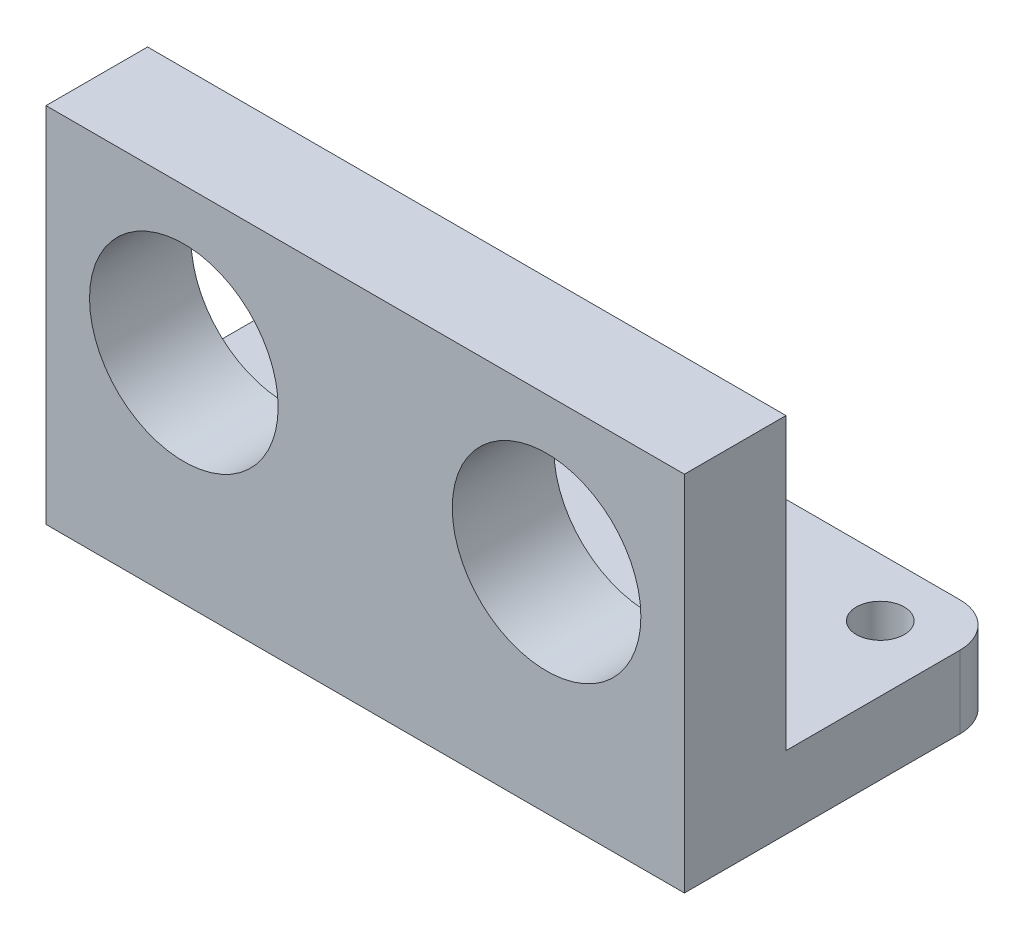
ISO-10303-21;
HEADER;
FILE_DESCRIPTION(('STEP AP214'),'2;1');
FILE_NAME('part.step','',(''),(''),'','','');
FILE_SCHEMA(('AUTOMOTIVE_DESIGN { 1 0 10303 214 1 1 1 1 }'));
ENDSEC;
DATA;
#1=APPLICATION_CONTEXT('core data for automotive mechanical design processes');
#2=APPLICATION_PROTOCOL_DEFINITION('international standard','automotive_design',2000,#1);
#3=PRODUCT_CONTEXT('',#1,'mechanical');
#4=PRODUCT('Part','Part','',(#3));
#5=PRODUCT_RELATED_PRODUCT_CATEGORY('part','',(#4));
#6=PRODUCT_DEFINITION_FORMATION('','',#4);
#7=PRODUCT_DEFINITION_CONTEXT('part definition',#1,'design');
#8=PRODUCT_DEFINITION('design','',#6,#7);
#9=PRODUCT_DEFINITION_SHAPE('','',#8);
#10=(LENGTH_UNIT() NAMED_UNIT(*) SI_UNIT(.MILLI.,.METRE.));
#11=(NAMED_UNIT(*) PLANE_ANGLE_UNIT() SI_UNIT($,.RADIAN.));
#12=(NAMED_UNIT(*) SI_UNIT($,.STERADIAN.) SOLID_ANGLE_UNIT());
#13=UNCERTAINTY_MEASURE_WITH_UNIT(LENGTH_MEASURE(1.E-05),#10,'distance_accuracy_value','');
#14=(GEOMETRIC_REPRESENTATION_CONTEXT(3) GLOBAL_UNCERTAINTY_ASSIGNED_CONTEXT((#13)) GLOBAL_UNIT_ASSIGNED_CONTEXT((#10,
#11,#12)) REPRESENTATION_CONTEXT('',''));
#15=CARTESIAN_POINT('',(0.,0.,0.));
#16=DIRECTION('',(0.,0.,1.));
#17=DIRECTION('',(1.,0.,0.));
#18=AXIS2_PLACEMENT_3D('',#15,#16,#17);
#19=CARTESIAN_POINT('',(0.,0.,7.));
#20=DIRECTION('',(0.,0.,1.));
#21=DIRECTION('',(1.,0.,0.));
#22=AXIS2_PLACEMENT_3D('',#19,#20,#21);
#23=PLANE('',#22);
#24=CARTESIAN_POINT('',(-12.5,0.,7.));
#25=DIRECTION('',(0.,0.,1.));
#26=DIRECTION('',(1.,0.,0.));
#27=AXIS2_PLACEMENT_3D('',#24,#25,#26);
#28=CIRCLE('',#27,6.5);
#29=CARTESIAN_POINT('',(-6.,0.,7.));
#30=VERTEX_POINT('',#29);
#31=EDGE_CURVE('E119',#30,#30,#28,.T.);
#32=ORIENTED_EDGE('',*,*,#31,.F.);
#33=EDGE_LOOP('',(#32));
#34=FACE_BOUND('',#33,.T.);
#35=DIRECTION('',(0.,-1.,0.));
#36=VECTOR('',#35,1.);
#37=CARTESIAN_POINT('',(-22.,-10.,7.));
#38=LINE('',#37,#36);
#39=CARTESIAN_POINT('',(-22.,10.,7.));
#40=VERTEX_POINT('',#39);
#41=CARTESIAN_POINT('',(-22.,-15.,7.));
#42=VERTEX_POINT('',#41);
#43=EDGE_CURVE('E131',#40,#42,#38,.T.);
#44=ORIENTED_EDGE('',*,*,#43,.T.);
#45=DIRECTION('',(1.,0.,0.));
#46=VECTOR('',#45,1.);
#47=CARTESIAN_POINT('',(-22.,-15.,7.));
#48=LINE('',#47,#46);
#49=CARTESIAN_POINT('',(22.,-15.,7.));
#50=VERTEX_POINT('',#49);
#51=EDGE_CURVE('E171',#42,#50,#48,.T.);
#52=ORIENTED_EDGE('',*,*,#51,.T.);
#53=DIRECTION('',(0.,1.,0.));
#54=VECTOR('',#53,1.);
#55=CARTESIAN_POINT('',(22.,-15.,7.));
#56=LINE('',#55,#54);
#57=CARTESIAN_POINT('',(22.,10.,7.));
#58=VERTEX_POINT('',#57);
#59=EDGE_CURVE('E167',#50,#58,#56,.T.);
#60=ORIENTED_EDGE('',*,*,#59,.T.);
#61=DIRECTION('',(-1.,0.,0.));
#62=VECTOR('',#61,1.);
#63=CARTESIAN_POINT('',(22.,10.,7.));
#64=LINE('',#63,#62);
#65=EDGE_CURVE('E127',#58,#40,#64,.T.);
#66=ORIENTED_EDGE('',*,*,#65,.T.);
#67=EDGE_LOOP('',(#44,#52,#60,#66));
#68=FACE_BOUND('',#67,.T.);
#69=CARTESIAN_POINT('',(12.5,0.,7.));
#70=DIRECTION('',(0.,0.,1.));
#71=DIRECTION('',(1.,0.,0.));
#72=AXIS2_PLACEMENT_3D('',#69,#70,#71);
#73=CIRCLE('',#72,6.50000000000001);
#74=CARTESIAN_POINT('',(19.,0.,7.));
#75=VERTEX_POINT('',#74);
#76=EDGE_CURVE('E177',#75,#75,#73,.T.);
#77=ORIENTED_EDGE('',*,*,#76,.F.);
#78=EDGE_LOOP('',(#77));
#79=FACE_BOUND('',#78,.T.);
#80=ADVANCED_FACE('F33',(#34,#68,#79),#23,.T.);
#81=CARTESIAN_POINT('',(0.,0.,0.));
#82=DIRECTION('',(0.,0.,1.));
#83=DIRECTION('',(1.,0.,0.));
#84=AXIS2_PLACEMENT_3D('',#81,#82,#83);
#85=PLANE('',#84);
#86=DIRECTION('',(0.,1.,0.));
#87=VECTOR('',#86,1.);
#88=CARTESIAN_POINT('',(22.,10.,0.));
#89=LINE('',#88,#87);
#90=CARTESIAN_POINT('',(22.,-10.,0.));
#91=VERTEX_POINT('',#90);
#92=CARTESIAN_POINT('',(22.,10.,0.));
#93=VERTEX_POINT('',#92);
#94=EDGE_CURVE('E100',#91,#93,#89,.T.);
#95=ORIENTED_EDGE('',*,*,#94,.F.);
#96=DIRECTION('',(-1.,0.,0.));
#97=VECTOR('',#96,1.);
#98=CARTESIAN_POINT('',(0.,-10.,0.));
#99=LINE('',#98,#97);
#100=CARTESIAN_POINT('',(-22.,-10.,0.));
#101=VERTEX_POINT('',#100);
#102=EDGE_CURVE('E107',#91,#101,#99,.T.);
#103=ORIENTED_EDGE('',*,*,#102,.T.);
#104=DIRECTION('',(0.,-1.,0.));
#105=VECTOR('',#104,1.);
#106=CARTESIAN_POINT('',(-22.,10.,0.));
#107=LINE('',#106,#105);
#108=CARTESIAN_POINT('',(-22.,10.,0.));
#109=VERTEX_POINT('',#108);
#110=EDGE_CURVE('E121',#109,#101,#107,.T.);
#111=ORIENTED_EDGE('',*,*,#110,.F.);
#112=DIRECTION('',(-1.,0.,0.));
#113=VECTOR('',#112,1.);
#114=CARTESIAN_POINT('',(22.,10.,0.));
#115=LINE('',#114,#113);
#116=EDGE_CURVE('E118',#93,#109,#115,.T.);
#117=ORIENTED_EDGE('',*,*,#116,.F.);
#118=EDGE_LOOP('',(#95,#103,#111,#117));
#119=FACE_BOUND('',#118,.T.);
#120=CARTESIAN_POINT('',(-12.5,0.,0.));
#121=DIRECTION('',(0.,0.,1.));
#122=DIRECTION('',(1.,0.,0.));
#123=AXIS2_PLACEMENT_3D('',#120,#121,#122);
#124=CIRCLE('',#123,6.5);
#125=CARTESIAN_POINT('',(-6.,0.,0.));
#126=VERTEX_POINT('',#125);
#127=EDGE_CURVE('E124',#126,#126,#124,.T.);
#128=ORIENTED_EDGE('',*,*,#127,.T.);
#129=EDGE_LOOP('',(#128));
#130=FACE_BOUND('',#129,.T.);
#131=CARTESIAN_POINT('',(12.5,0.,0.));
#132=DIRECTION('',(0.,0.,1.));
#133=DIRECTION('',(1.,0.,0.));
#134=AXIS2_PLACEMENT_3D('',#131,#132,#133);
#135=CIRCLE('',#134,6.50000000000001);
#136=CARTESIAN_POINT('',(19.,0.,0.));
#137=VERTEX_POINT('',#136);
#138=EDGE_CURVE('E179',#137,#137,#135,.T.);
#139=ORIENTED_EDGE('',*,*,#138,.T.);
#140=EDGE_LOOP('',(#139));
#141=FACE_BOUND('',#140,.T.);
#142=ADVANCED_FACE('F116',(#119,#130,#141),#85,.F.);
#143=CARTESIAN_POINT('',(-22.,-15.,7.));
#144=DIRECTION('',(0.,1.,0.));
#145=DIRECTION('',(-1.,0.,0.));
#146=AXIS2_PLACEMENT_3D('',#143,#144,#145);
#147=PLANE('',#146);
#148=CARTESIAN_POINT('',(17.5,-15.,-10.9999999999999));
#149=DIRECTION('',(0.,1.,0.));
#150=DIRECTION('',(0.,0.,1.));
#151=AXIS2_PLACEMENT_3D('',#148,#149,#150);
#152=CIRCLE('',#151,1.651);
#153=CARTESIAN_POINT('',(17.5,-15.,-9.3489999999999));
#154=VERTEX_POINT('',#153);
#155=EDGE_CURVE('E113',#154,#154,#152,.T.);
#156=ORIENTED_EDGE('',*,*,#155,.T.);
#157=EDGE_LOOP('',(#156));
#158=FACE_BOUND('',#157,.T.);
#159=CARTESIAN_POINT('',(0.,-15.,-10.9999999999999));
#160=DIRECTION('',(0.,1.,0.));
#161=DIRECTION('',(0.,0.,1.));
#162=AXIS2_PLACEMENT_3D('',#159,#160,#161);
#163=CIRCLE('',#162,1.651);
#164=CARTESIAN_POINT('',(0.,-15.,-9.34899999999987));
#165=VERTEX_POINT('',#164);
#166=EDGE_CURVE('E192',#165,#165,#163,.T.);
#167=ORIENTED_EDGE('',*,*,#166,.T.);
#168=EDGE_LOOP('',(#167));
#169=FACE_BOUND('',#168,.T.);
#170=CARTESIAN_POINT('',(-17.5,-15.,-10.9999999999999));
#171=DIRECTION('',(0.,1.,0.));
#172=DIRECTION('',(0.,0.,1.));
#173=AXIS2_PLACEMENT_3D('',#170,#171,#172);
#174=CIRCLE('',#173,1.651);
#175=CARTESIAN_POINT('',(-17.5,-15.,-9.3489999999999));
#176=VERTEX_POINT('',#175);
#177=EDGE_CURVE('E186',#176,#176,#174,.T.);
#178=ORIENTED_EDGE('',*,*,#177,.T.);
#179=EDGE_LOOP('',(#178));
#180=FACE_BOUND('',#179,.T.);
#181=DIRECTION('',(-1.,0.,0.));
#182=VECTOR('',#181,1.);
#183=CARTESIAN_POINT('',(0.,-15.,-15.));
#184=LINE('',#183,#182);
#185=CARTESIAN_POINT('',(19.,-15.,-15.));
#186=VERTEX_POINT('',#185);
#187=CARTESIAN_POINT('',(-19.,-15.,-15.));
#188=VERTEX_POINT('',#187);
#189=EDGE_CURVE('E112',#186,#188,#184,.T.);
#190=ORIENTED_EDGE('',*,*,#189,.F.);
#191=CARTESIAN_POINT('',(19.,-15.,-12.));
#192=DIRECTION('',(0.,1.,0.));
#193=DIRECTION('',(-1.,0.,0.));
#194=AXIS2_PLACEMENT_3D('',#191,#192,#193);
#195=CIRCLE('',#194,3.);
#196=CARTESIAN_POINT('',(22.,-15.,-12.));
#197=VERTEX_POINT('',#196);
#198=EDGE_CURVE('E150',#186,#197,#195,.F.);
#199=ORIENTED_EDGE('',*,*,#198,.T.);
#200=DIRECTION('',(0.,0.,-1.));
#201=VECTOR('',#200,1.);
#202=CARTESIAN_POINT('',(22.,-15.,7.));
#203=LINE('',#202,#201);
#204=EDGE_CURVE('E137',#50,#197,#203,.T.);
#205=ORIENTED_EDGE('',*,*,#204,.F.);
#206=ORIENTED_EDGE('',*,*,#51,.F.);
#207=DIRECTION('',(0.,0.,-1.));
#208=VECTOR('',#207,1.);
#209=CARTESIAN_POINT('',(-22.,-15.,7.));
#210=LINE('',#209,#208);
#211=CARTESIAN_POINT('',(-22.,-15.,-12.));
#212=VERTEX_POINT('',#211);
#213=EDGE_CURVE('E139',#42,#212,#210,.T.);
#214=ORIENTED_EDGE('',*,*,#213,.T.);
#215=CARTESIAN_POINT('',(-19.,-15.,-12.));
#216=DIRECTION('',(0.,1.,0.));
#217=DIRECTION('',(-1.,0.,0.));
#218=AXIS2_PLACEMENT_3D('',#215,#216,#217);
#219=CIRCLE('',#218,3.);
#220=EDGE_CURVE('E148',#212,#188,#219,.F.);
#221=ORIENTED_EDGE('',*,*,#220,.T.);
#222=EDGE_LOOP('',(#190,#199,#205,#206,#214,#221));
#223=FACE_BOUND('',#222,.T.);
#224=ADVANCED_FACE('F165',(#158,#169,#180,#223),#147,.F.);
#225=CARTESIAN_POINT('',(22.,10.,7.));
#226=DIRECTION('',(-1.,0.,0.));
#227=DIRECTION('',(0.,0.,1.));
#228=AXIS2_PLACEMENT_3D('',#225,#226,#227);
#229=PLANE('',#228);
#230=ORIENTED_EDGE('',*,*,#204,.T.);
#231=DIRECTION('',(0.,-1.,0.));
#232=VECTOR('',#231,1.);
#233=CARTESIAN_POINT('',(22.,-10.,-12.));
#234=LINE('',#233,#232);
#235=CARTESIAN_POINT('',(22.,-10.,-12.));
#236=VERTEX_POINT('',#235);
#237=EDGE_CURVE('E56',#197,#236,#234,.F.);
#238=ORIENTED_EDGE('',*,*,#237,.T.);
#239=DIRECTION('',(0.,0.,1.));
#240=VECTOR('',#239,1.);
#241=CARTESIAN_POINT('',(22.,-10.,-15.));
#242=LINE('',#241,#240);
#243=EDGE_CURVE('E95',#236,#91,#242,.T.);
#244=ORIENTED_EDGE('',*,*,#243,.T.);
#245=ORIENTED_EDGE('',*,*,#94,.T.);
#246=DIRECTION('',(0.,0.,-1.));
#247=VECTOR('',#246,1.);
#248=CARTESIAN_POINT('',(22.,10.,7.));
#249=LINE('',#248,#247);
#250=EDGE_CURVE('E135',#58,#93,#249,.T.);
#251=ORIENTED_EDGE('',*,*,#250,.F.);
#252=ORIENTED_EDGE('',*,*,#59,.F.);
#253=EDGE_LOOP('',(#230,#238,#244,#245,#251,#252));
#254=FACE_BOUND('',#253,.T.);
#255=ADVANCED_FACE('F97',(#254),#229,.F.);
#256=CARTESIAN_POINT('',(22.,10.,7.));
#257=DIRECTION('',(0.,-1.,0.));
#258=DIRECTION('',(0.,0.,-1.));
#259=AXIS2_PLACEMENT_3D('',#256,#257,#258);
#260=PLANE('',#259);
#261=ORIENTED_EDGE('',*,*,#116,.T.);
#262=DIRECTION('',(0.,0.,-1.));
#263=VECTOR('',#262,1.);
#264=CARTESIAN_POINT('',(-22.,10.,7.));
#265=LINE('',#264,#263);
#266=EDGE_CURVE('E132',#40,#109,#265,.T.);
#267=ORIENTED_EDGE('',*,*,#266,.F.);
#268=ORIENTED_EDGE('',*,*,#65,.F.);
#269=ORIENTED_EDGE('',*,*,#250,.T.);
#270=EDGE_LOOP('',(#261,#267,#268,#269));
#271=FACE_BOUND('',#270,.T.);
#272=ADVANCED_FACE('F248',(#271),#260,.F.);
#273=CARTESIAN_POINT('',(-22.,10.,7.));
#274=DIRECTION('',(1.,0.,0.));
#275=DIRECTION('',(0.,0.,-1.));
#276=AXIS2_PLACEMENT_3D('',#273,#274,#275);
#277=PLANE('',#276);
#278=DIRECTION('',(0.,0.,1.));
#279=VECTOR('',#278,1.);
#280=CARTESIAN_POINT('',(-22.,-10.,-15.));
#281=LINE('',#280,#279);
#282=CARTESIAN_POINT('',(-22.,-10.,-12.));
#283=VERTEX_POINT('',#282);
#284=EDGE_CURVE('E103',#283,#101,#281,.T.);
#285=ORIENTED_EDGE('',*,*,#284,.F.);
#286=DIRECTION('',(0.,1.,0.));
#287=VECTOR('',#286,1.);
#288=CARTESIAN_POINT('',(-22.,-15.,-12.));
#289=LINE('',#288,#287);
#290=EDGE_CURVE('E11',#283,#212,#289,.F.);
#291=ORIENTED_EDGE('',*,*,#290,.T.);
#292=ORIENTED_EDGE('',*,*,#213,.F.);
#293=ORIENTED_EDGE('',*,*,#43,.F.);
#294=ORIENTED_EDGE('',*,*,#266,.T.);
#295=ORIENTED_EDGE('',*,*,#110,.T.);
#296=EDGE_LOOP('',(#285,#291,#292,#293,#294,#295));
#297=FACE_BOUND('',#296,.T.);
#298=ADVANCED_FACE('F245',(#297),#277,.F.);
#299=CARTESIAN_POINT('',(-12.5,0.,7.));
#300=DIRECTION('',(0.,0.,-1.));
#301=DIRECTION('',(-1.,0.,0.));
#302=AXIS2_PLACEMENT_3D('',#299,#300,#301);
#303=CYLINDRICAL_SURFACE('',#302,6.5);
#304=ORIENTED_EDGE('',*,*,#31,.T.);
#305=EDGE_LOOP('',(#304));
#306=FACE_BOUND('',#305,.T.);
#307=ORIENTED_EDGE('',*,*,#127,.F.);
#308=EDGE_LOOP('',(#307));
#309=FACE_BOUND('',#308,.T.);
#310=ADVANCED_FACE('F242',(#306,#309),#303,.F.);
#311=CARTESIAN_POINT('',(12.5,0.,7.));
#312=DIRECTION('',(0.,0.,-1.));
#313=DIRECTION('',(-1.,0.,0.));
#314=AXIS2_PLACEMENT_3D('',#311,#312,#313);
#315=CYLINDRICAL_SURFACE('',#314,6.50000000000001);
#316=ORIENTED_EDGE('',*,*,#76,.T.);
#317=EDGE_LOOP('',(#316));
#318=FACE_BOUND('',#317,.T.);
#319=ORIENTED_EDGE('',*,*,#138,.F.);
#320=EDGE_LOOP('',(#319));
#321=FACE_BOUND('',#320,.T.);
#322=ADVANCED_FACE('F215',(#318,#321),#315,.F.);
#323=CARTESIAN_POINT('',(0.,-10.,-15.));
#324=DIRECTION('',(0.,1.,0.));
#325=DIRECTION('',(0.,0.,1.));
#326=AXIS2_PLACEMENT_3D('',#323,#324,#325);
#327=PLANE('',#326);
#328=CARTESIAN_POINT('',(17.5,-10.,-10.9999999999999));
#329=DIRECTION('',(0.,1.,0.));
#330=DIRECTION('',(0.,0.,1.));
#331=AXIS2_PLACEMENT_3D('',#328,#329,#330);
#332=CIRCLE('',#331,1.651);
#333=CARTESIAN_POINT('',(17.5,-10.,-9.3489999999999));
#334=VERTEX_POINT('',#333);
#335=EDGE_CURVE('E198',#334,#334,#332,.T.);
#336=ORIENTED_EDGE('',*,*,#335,.F.);
#337=EDGE_LOOP('',(#336));
#338=FACE_BOUND('',#337,.T.);
#339=CARTESIAN_POINT('',(0.,-10.,-10.9999999999999));
#340=DIRECTION('',(0.,1.,0.));
#341=DIRECTION('',(0.,0.,1.));
#342=AXIS2_PLACEMENT_3D('',#339,#340,#341);
#343=CIRCLE('',#342,1.651);
#344=CARTESIAN_POINT('',(0.,-10.,-9.34899999999987));
#345=VERTEX_POINT('',#344);
#346=EDGE_CURVE('E195',#345,#345,#343,.T.);
#347=ORIENTED_EDGE('',*,*,#346,.F.);
#348=EDGE_LOOP('',(#347));
#349=FACE_BOUND('',#348,.T.);
#350=CARTESIAN_POINT('',(-17.5,-10.,-10.9999999999999));
#351=DIRECTION('',(0.,1.,0.));
#352=DIRECTION('',(0.,0.,1.));
#353=AXIS2_PLACEMENT_3D('',#350,#351,#352);
#354=CIRCLE('',#353,1.651);
#355=CARTESIAN_POINT('',(-17.5,-10.,-9.3489999999999));
#356=VERTEX_POINT('',#355);
#357=EDGE_CURVE('E189',#356,#356,#354,.T.);
#358=ORIENTED_EDGE('',*,*,#357,.F.);
#359=EDGE_LOOP('',(#358));
#360=FACE_BOUND('',#359,.T.);
#361=ORIENTED_EDGE('',*,*,#243,.F.);
#362=CARTESIAN_POINT('',(19.,-10.,-12.));
#363=DIRECTION('',(0.,1.,0.));
#364=DIRECTION('',(0.,0.,1.));
#365=AXIS2_PLACEMENT_3D('',#362,#363,#364);
#366=CIRCLE('',#365,3.);
#367=CARTESIAN_POINT('',(19.,-10.,-15.));
#368=VERTEX_POINT('',#367);
#369=EDGE_CURVE('E41',#236,#368,#366,.T.);
#370=ORIENTED_EDGE('',*,*,#369,.T.);
#371=DIRECTION('',(-1.,0.,0.));
#372=VECTOR('',#371,1.);
#373=CARTESIAN_POINT('',(0.,-10.,-15.));
#374=LINE('',#373,#372);
#375=CARTESIAN_POINT('',(-19.,-10.,-15.));
#376=VERTEX_POINT('',#375);
#377=EDGE_CURVE('E104',#368,#376,#374,.T.);
#378=ORIENTED_EDGE('',*,*,#377,.T.);
#379=CARTESIAN_POINT('',(-19.,-10.,-12.));
#380=DIRECTION('',(0.,1.,0.));
#381=DIRECTION('',(0.,0.,1.));
#382=AXIS2_PLACEMENT_3D('',#379,#380,#381);
#383=CIRCLE('',#382,3.);
#384=EDGE_CURVE('E48',#376,#283,#383,.T.);
#385=ORIENTED_EDGE('',*,*,#384,.T.);
#386=ORIENTED_EDGE('',*,*,#284,.T.);
#387=ORIENTED_EDGE('',*,*,#102,.F.);
#388=EDGE_LOOP('',(#361,#370,#378,#385,#386,#387));
#389=FACE_BOUND('',#388,.T.);
#390=ADVANCED_FACE('F108',(#338,#349,#360,#389),#327,.T.);
#391=CARTESIAN_POINT('',(0.,0.,-15.));
#392=DIRECTION('',(0.,0.,-1.));
#393=DIRECTION('',(-1.,0.,0.));
#394=AXIS2_PLACEMENT_3D('',#391,#392,#393);
#395=PLANE('',#394);
#396=ORIENTED_EDGE('',*,*,#377,.F.);
#397=DIRECTION('',(0.,-1.,0.));
#398=VECTOR('',#397,1.);
#399=CARTESIAN_POINT('',(19.,-15.,-15.));
#400=LINE('',#399,#398);
#401=EDGE_CURVE('E145',#368,#186,#400,.T.);
#402=ORIENTED_EDGE('',*,*,#401,.T.);
#403=ORIENTED_EDGE('',*,*,#189,.T.);
#404=DIRECTION('',(0.,1.,0.));
#405=VECTOR('',#404,1.);
#406=CARTESIAN_POINT('',(-19.,-10.,-15.));
#407=LINE('',#406,#405);
#408=EDGE_CURVE('E142',#188,#376,#407,.T.);
#409=ORIENTED_EDGE('',*,*,#408,.T.);
#410=EDGE_LOOP('',(#396,#402,#403,#409));
#411=FACE_BOUND('',#410,.T.);
#412=ADVANCED_FACE('F157',(#411),#395,.T.);
#413=CARTESIAN_POINT('',(-17.5,-15.,-10.9999999999999));
#414=DIRECTION('',(0.,1.,0.));
#415=DIRECTION('',(0.,0.,1.));
#416=AXIS2_PLACEMENT_3D('',#413,#414,#415);
#417=CYLINDRICAL_SURFACE('',#416,1.651);
#418=ORIENTED_EDGE('',*,*,#177,.F.);
#419=EDGE_LOOP('',(#418));
#420=FACE_BOUND('',#419,.T.);
#421=ORIENTED_EDGE('',*,*,#357,.T.);
#422=EDGE_LOOP('',(#421));
#423=FACE_BOUND('',#422,.T.);
#424=ADVANCED_FACE('F221',(#420,#423),#417,.F.);
#425=CARTESIAN_POINT('',(0.,-15.,-10.9999999999999));
#426=DIRECTION('',(0.,1.,0.));
#427=DIRECTION('',(0.,0.,1.));
#428=AXIS2_PLACEMENT_3D('',#425,#426,#427);
#429=CYLINDRICAL_SURFACE('',#428,1.651);
#430=ORIENTED_EDGE('',*,*,#166,.F.);
#431=EDGE_LOOP('',(#430));
#432=FACE_BOUND('',#431,.T.);
#433=ORIENTED_EDGE('',*,*,#346,.T.);
#434=EDGE_LOOP('',(#433));
#435=FACE_BOUND('',#434,.T.);
#436=ADVANCED_FACE('F209',(#432,#435),#429,.F.);
#437=CARTESIAN_POINT('',(17.5,-15.,-10.9999999999999));
#438=DIRECTION('',(0.,1.,0.));
#439=DIRECTION('',(0.,0.,1.));
#440=AXIS2_PLACEMENT_3D('',#437,#438,#439);
#441=CYLINDRICAL_SURFACE('',#440,1.651);
#442=ORIENTED_EDGE('',*,*,#155,.F.);
#443=EDGE_LOOP('',(#442));
#444=FACE_BOUND('',#443,.T.);
#445=ORIENTED_EDGE('',*,*,#335,.T.);
#446=EDGE_LOOP('',(#445));
#447=FACE_BOUND('',#446,.T.);
#448=ADVANCED_FACE('F206',(#444,#447),#441,.F.);
#449=CARTESIAN_POINT('',(19.,0.,-12.));
#450=DIRECTION('',(0.,1.,0.));
#451=DIRECTION('',(0.,0.,1.));
#452=AXIS2_PLACEMENT_3D('',#449,#450,#451);
#453=CYLINDRICAL_SURFACE('',#452,3.);
#454=ORIENTED_EDGE('',*,*,#369,.F.);
#455=ORIENTED_EDGE('',*,*,#237,.F.);
#456=ORIENTED_EDGE('',*,*,#198,.F.);
#457=ORIENTED_EDGE('',*,*,#401,.F.);
#458=EDGE_LOOP('',(#454,#455,#456,#457));
#459=FACE_BOUND('',#458,.T.);
#460=ADVANCED_FACE('F162',(#459),#453,.T.);
#461=CARTESIAN_POINT('',(-19.,0.,-12.));
#462=DIRECTION('',(0.,-1.,0.));
#463=DIRECTION('',(0.,0.,-1.));
#464=AXIS2_PLACEMENT_3D('',#461,#462,#463);
#465=CYLINDRICAL_SURFACE('',#464,3.);
#466=ORIENTED_EDGE('',*,*,#220,.F.);
#467=ORIENTED_EDGE('',*,*,#290,.F.);
#468=ORIENTED_EDGE('',*,*,#384,.F.);
#469=ORIENTED_EDGE('',*,*,#408,.F.);
#470=EDGE_LOOP('',(#466,#467,#468,#469));
#471=FACE_BOUND('',#470,.T.);
#472=ADVANCED_FACE('F35',(#471),#465,.T.);
#473=CLOSED_SHELL('',(#80,#142,#224,#255,#272,#298,#310,#322,#390,#412,#424,#436,#448,#460,#472));
#474=MANIFOLD_SOLID_BREP('B2',#473);
#475=ADVANCED_BREP_SHAPE_REPRESENTATION('',(#18,#474),#14);
#476=SHAPE_DEFINITION_REPRESENTATION(#9,#475);
ENDSEC;
END-ISO-10303-21;
